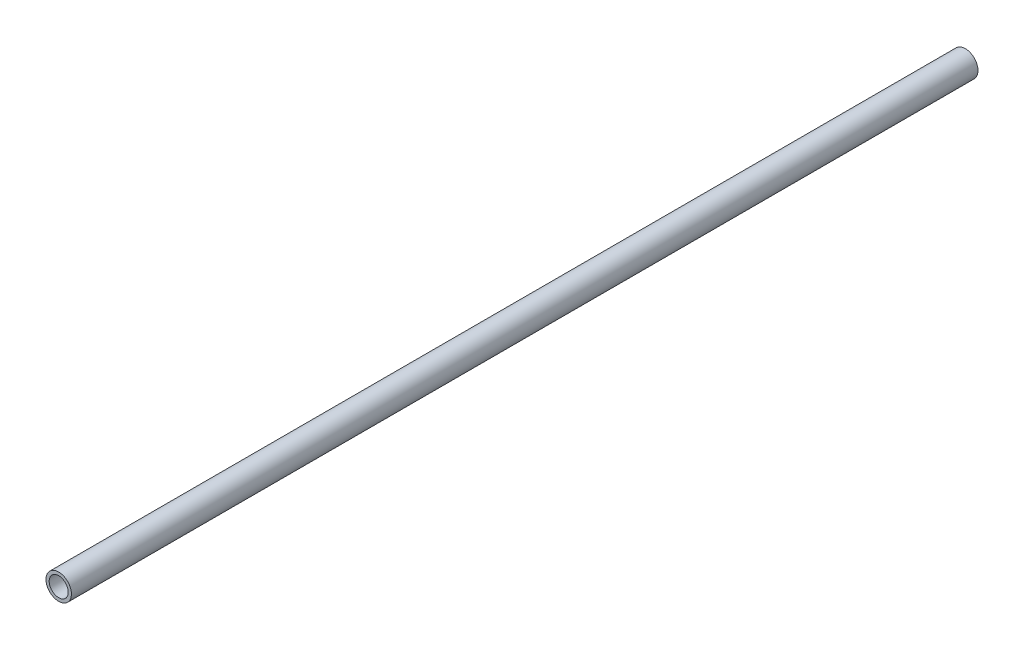
ISO-10303-21;
HEADER;
FILE_DESCRIPTION(('STEP AP214'),'2;1');
FILE_NAME('part.step','',(''),(''),'','','');
FILE_SCHEMA(('AUTOMOTIVE_DESIGN { 1 0 10303 214 1 1 1 1 }'));
ENDSEC;
DATA;
#1=APPLICATION_CONTEXT('core data for automotive mechanical design processes');
#2=APPLICATION_PROTOCOL_DEFINITION('international standard','automotive_design',2000,#1);
#3=PRODUCT_CONTEXT('',#1,'mechanical');
#4=PRODUCT('Part','Part','',(#3));
#5=PRODUCT_RELATED_PRODUCT_CATEGORY('part','',(#4));
#6=PRODUCT_DEFINITION_FORMATION('','',#4);
#7=PRODUCT_DEFINITION_CONTEXT('part definition',#1,'design');
#8=PRODUCT_DEFINITION('design','',#6,#7);
#9=PRODUCT_DEFINITION_SHAPE('','',#8);
#10=(LENGTH_UNIT() NAMED_UNIT(*) SI_UNIT(.MILLI.,.METRE.));
#11=(NAMED_UNIT(*) PLANE_ANGLE_UNIT() SI_UNIT($,.RADIAN.));
#12=(NAMED_UNIT(*) SI_UNIT($,.STERADIAN.) SOLID_ANGLE_UNIT());
#13=UNCERTAINTY_MEASURE_WITH_UNIT(LENGTH_MEASURE(1.E-05),#10,'distance_accuracy_value','');
#14=(GEOMETRIC_REPRESENTATION_CONTEXT(3) GLOBAL_UNCERTAINTY_ASSIGNED_CONTEXT((#13)) GLOBAL_UNIT_ASSIGNED_CONTEXT((#10,
#11,#12)) REPRESENTATION_CONTEXT('',''));
#15=CARTESIAN_POINT('',(0.,0.,0.));
#16=DIRECTION('',(0.,0.,1.));
#17=DIRECTION('',(1.,0.,0.));
#18=AXIS2_PLACEMENT_3D('',#15,#16,#17);
#19=CARTESIAN_POINT('',(0.,0.,285.));
#20=DIRECTION('',(0.,0.,1.));
#21=DIRECTION('',(1.,0.,0.));
#22=AXIS2_PLACEMENT_3D('',#19,#20,#21);
#23=PLANE('',#22);
#24=CARTESIAN_POINT('',(0.,0.,285.));
#25=DIRECTION('',(0.,0.,1.));
#26=DIRECTION('',(1.,0.,0.));
#27=AXIS2_PLACEMENT_3D('',#24,#25,#26);
#28=CIRCLE('',#27,4.);
#29=CARTESIAN_POINT('',(4.,0.,285.));
#30=VERTEX_POINT('',#29);
#31=EDGE_CURVE('E10',#30,#30,#28,.T.);
#32=ORIENTED_EDGE('',*,*,#31,.T.);
#33=EDGE_LOOP('',(#32));
#34=FACE_BOUND('',#33,.T.);
#35=CARTESIAN_POINT('',(0.,0.,285.));
#36=DIRECTION('',(0.,0.,1.));
#37=DIRECTION('',(1.,0.,0.));
#38=AXIS2_PLACEMENT_3D('',#35,#36,#37);
#39=CIRCLE('',#38,3.);
#40=CARTESIAN_POINT('',(3.,0.,285.));
#41=VERTEX_POINT('',#40);
#42=EDGE_CURVE('E42',#41,#41,#39,.T.);
#43=ORIENTED_EDGE('',*,*,#42,.F.);
#44=EDGE_LOOP('',(#43));
#45=FACE_BOUND('',#44,.T.);
#46=ADVANCED_FACE('F31',(#34,#45),#23,.T.);
#47=CARTESIAN_POINT('',(0.,0.,0.));
#48=DIRECTION('',(0.,0.,1.));
#49=DIRECTION('',(1.,0.,0.));
#50=AXIS2_PLACEMENT_3D('',#47,#48,#49);
#51=PLANE('',#50);
#52=CARTESIAN_POINT('',(0.,0.,0.));
#53=DIRECTION('',(0.,0.,1.));
#54=DIRECTION('',(1.,0.,0.));
#55=AXIS2_PLACEMENT_3D('',#52,#53,#54);
#56=CIRCLE('',#55,4.);
#57=CARTESIAN_POINT('',(4.,0.,0.));
#58=VERTEX_POINT('',#57);
#59=EDGE_CURVE('E35',#58,#58,#56,.T.);
#60=ORIENTED_EDGE('',*,*,#59,.F.);
#61=EDGE_LOOP('',(#60));
#62=FACE_BOUND('',#61,.T.);
#63=CARTESIAN_POINT('',(0.,0.,0.));
#64=DIRECTION('',(0.,0.,1.));
#65=DIRECTION('',(1.,0.,0.));
#66=AXIS2_PLACEMENT_3D('',#63,#64,#65);
#67=CIRCLE('',#66,3.);
#68=CARTESIAN_POINT('',(3.,0.,0.));
#69=VERTEX_POINT('',#68);
#70=EDGE_CURVE('E44',#69,#69,#67,.T.);
#71=ORIENTED_EDGE('',*,*,#70,.T.);
#72=EDGE_LOOP('',(#71));
#73=FACE_BOUND('',#72,.T.);
#74=ADVANCED_FACE('F54',(#62,#73),#51,.F.);
#75=CARTESIAN_POINT('',(0.,0.,285.));
#76=DIRECTION('',(0.,0.,-1.));
#77=DIRECTION('',(-1.,0.,0.));
#78=AXIS2_PLACEMENT_3D('',#75,#76,#77);
#79=CYLINDRICAL_SURFACE('',#78,4.);
#80=ORIENTED_EDGE('',*,*,#31,.F.);
#81=EDGE_LOOP('',(#80));
#82=FACE_BOUND('',#81,.T.);
#83=ORIENTED_EDGE('',*,*,#59,.T.);
#84=EDGE_LOOP('',(#83));
#85=FACE_BOUND('',#84,.T.);
#86=ADVANCED_FACE('F33',(#82,#85),#79,.T.);
#87=CARTESIAN_POINT('',(0.,0.,285.));
#88=DIRECTION('',(0.,0.,-1.));
#89=DIRECTION('',(-1.,0.,0.));
#90=AXIS2_PLACEMENT_3D('',#87,#88,#89);
#91=CYLINDRICAL_SURFACE('',#90,3.);
#92=ORIENTED_EDGE('',*,*,#42,.T.);
#93=EDGE_LOOP('',(#92));
#94=FACE_BOUND('',#93,.T.);
#95=ORIENTED_EDGE('',*,*,#70,.F.);
#96=EDGE_LOOP('',(#95));
#97=FACE_BOUND('',#96,.T.);
#98=ADVANCED_FACE('F50',(#94,#97),#91,.F.);
#99=CLOSED_SHELL('',(#46,#74,#86,#98));
#100=MANIFOLD_SOLID_BREP('B2',#99);
#101=ADVANCED_BREP_SHAPE_REPRESENTATION('',(#18,#100),#14);
#102=SHAPE_DEFINITION_REPRESENTATION(#9,#101);
ENDSEC;
END-ISO-10303-21;
